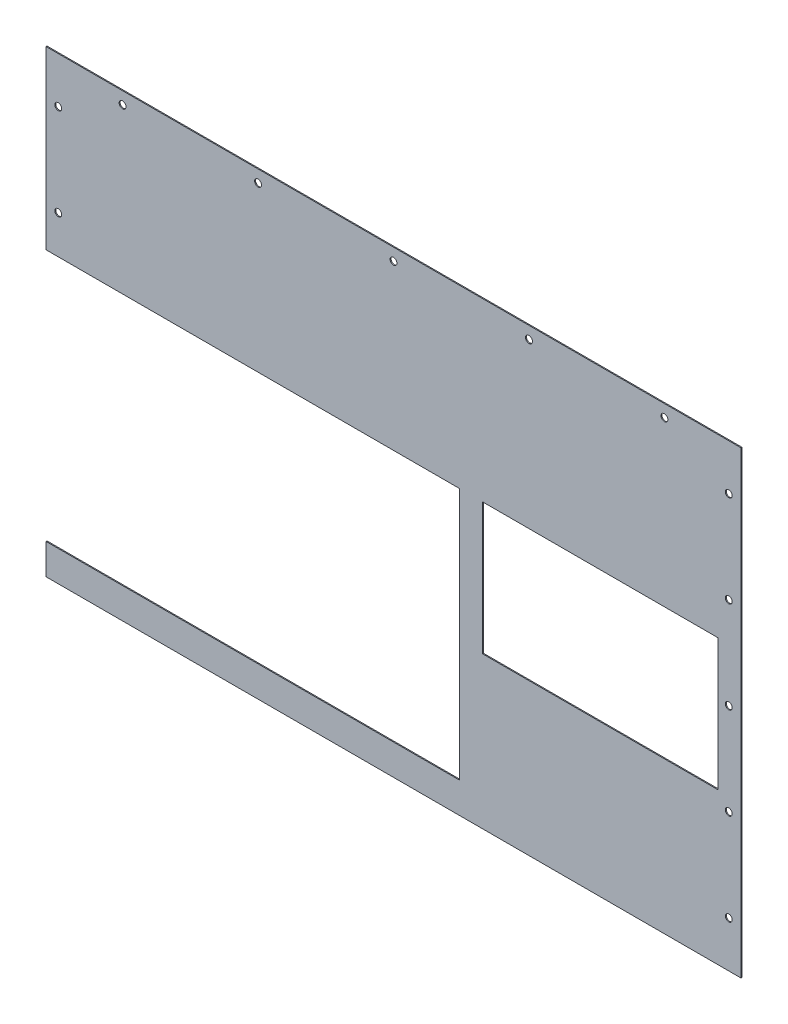
ISO-10303-21;
HEADER;
FILE_DESCRIPTION(('STEP AP214'),'2;1');
FILE_NAME('part.step','',(''),(''),'','','');
FILE_SCHEMA(('AUTOMOTIVE_DESIGN { 1 0 10303 214 1 1 1 1 }'));
ENDSEC;
DATA;
#1=APPLICATION_CONTEXT('core data for automotive mechanical design processes');
#2=APPLICATION_PROTOCOL_DEFINITION('international standard','automotive_design',2000,#1);
#3=PRODUCT_CONTEXT('',#1,'mechanical');
#4=PRODUCT('Part','Part','',(#3));
#5=PRODUCT_RELATED_PRODUCT_CATEGORY('part','',(#4));
#6=PRODUCT_DEFINITION_FORMATION('','',#4);
#7=PRODUCT_DEFINITION_CONTEXT('part definition',#1,'design');
#8=PRODUCT_DEFINITION('design','',#6,#7);
#9=PRODUCT_DEFINITION_SHAPE('','',#8);
#10=(LENGTH_UNIT() NAMED_UNIT(*) SI_UNIT(.MILLI.,.METRE.));
#11=(NAMED_UNIT(*) PLANE_ANGLE_UNIT() SI_UNIT($,.RADIAN.));
#12=(NAMED_UNIT(*) SI_UNIT($,.STERADIAN.) SOLID_ANGLE_UNIT());
#13=UNCERTAINTY_MEASURE_WITH_UNIT(LENGTH_MEASURE(1.E-05),#10,'distance_accuracy_value','');
#14=(GEOMETRIC_REPRESENTATION_CONTEXT(3) GLOBAL_UNCERTAINTY_ASSIGNED_CONTEXT((#13)) GLOBAL_UNIT_ASSIGNED_CONTEXT((#10,
#11,#12)) REPRESENTATION_CONTEXT('',''));
#15=CARTESIAN_POINT('',(0.,0.,0.));
#16=DIRECTION('',(0.,0.,1.));
#17=DIRECTION('',(1.,0.,0.));
#18=AXIS2_PLACEMENT_3D('',#15,#16,#17);
#19=CARTESIAN_POINT('',(0.,0.,0.635));
#20=DIRECTION('',(0.,0.,1.));
#21=DIRECTION('',(1.,0.,0.));
#22=AXIS2_PLACEMENT_3D('',#19,#20,#21);
#23=PLANE('',#22);
#24=CARTESIAN_POINT('',(162.424379893647,-80.1133012939924,0.635));
#25=DIRECTION('',(0.,0.,-1.));
#26=DIRECTION('',(-1.,0.,0.));
#27=AXIS2_PLACEMENT_3D('',#24,#25,#26);
#28=CIRCLE('',#27,2.248);
#29=CARTESIAN_POINT('',(160.176379893647,-80.1133012939924,0.635));
#30=VERTEX_POINT('',#29);
#31=EDGE_CURVE('E516',#30,#30,#28,.T.);
#32=ORIENTED_EDGE('',*,*,#31,.T.);
#33=EDGE_LOOP('',(#32));
#34=FACE_BOUND('',#33,.T.);
#35=CARTESIAN_POINT('',(162.424379893647,-20.1133012939924,0.635));
#36=DIRECTION('',(0.,0.,-1.));
#37=DIRECTION('',(-1.,0.,0.));
#38=AXIS2_PLACEMENT_3D('',#35,#36,#37);
#39=CIRCLE('',#38,2.248);
#40=CARTESIAN_POINT('',(160.176379893647,-20.1133012939924,0.635));
#41=VERTEX_POINT('',#40);
#42=EDGE_CURVE('E524',#41,#41,#39,.T.);
#43=ORIENTED_EDGE('',*,*,#42,.T.);
#44=EDGE_LOOP('',(#43));
#45=FACE_BOUND('',#44,.T.);
#46=CARTESIAN_POINT('',(162.424379893647,39.8866987060076,0.635));
#47=DIRECTION('',(0.,0.,-1.));
#48=DIRECTION('',(-1.,0.,0.));
#49=AXIS2_PLACEMENT_3D('',#46,#47,#48);
#50=CIRCLE('',#49,2.248);
#51=CARTESIAN_POINT('',(160.176379893647,39.8866987060076,0.635));
#52=VERTEX_POINT('',#51);
#53=EDGE_CURVE('E530',#52,#52,#50,.T.);
#54=ORIENTED_EDGE('',*,*,#53,.T.);
#55=EDGE_LOOP('',(#54));
#56=FACE_BOUND('',#55,.T.);
#57=CARTESIAN_POINT('',(162.424379893647,99.8866987060076,0.635));
#58=DIRECTION('',(0.,0.,-1.));
#59=DIRECTION('',(-1.,0.,0.));
#60=AXIS2_PLACEMENT_3D('',#57,#58,#59);
#61=CIRCLE('',#60,2.248);
#62=CARTESIAN_POINT('',(160.176379893647,99.8866987060076,0.635));
#63=VERTEX_POINT('',#62);
#64=EDGE_CURVE('E536',#63,#63,#61,.T.);
#65=ORIENTED_EDGE('',*,*,#64,.T.);
#66=EDGE_LOOP('',(#65));
#67=FACE_BOUND('',#66,.T.);
#68=CARTESIAN_POINT('',(162.424379893647,159.886698706008,0.635));
#69=DIRECTION('',(0.,0.,-1.));
#70=DIRECTION('',(-1.,0.,0.));
#71=AXIS2_PLACEMENT_3D('',#68,#69,#70);
#72=CIRCLE('',#71,2.248);
#73=CARTESIAN_POINT('',(160.176379893647,159.886698706008,0.635));
#74=VERTEX_POINT('',#73);
#75=EDGE_CURVE('E242',#74,#74,#72,.T.);
#76=ORIENTED_EDGE('',*,*,#75,.T.);
#77=EDGE_LOOP('',(#76));
#78=FACE_BOUND('',#77,.T.);
#79=CARTESIAN_POINT('',(-275.625620106353,159.886698706008,0.635));
#80=DIRECTION('',(0.,0.,1.));
#81=DIRECTION('',(1.,0.,0.));
#82=AXIS2_PLACEMENT_3D('',#79,#80,#81);
#83=CIRCLE('',#82,2.248);
#84=CARTESIAN_POINT('',(-273.377620106353,159.886698706008,0.635));
#85=VERTEX_POINT('',#84);
#86=EDGE_CURVE('E239',#85,#85,#83,.T.);
#87=ORIENTED_EDGE('',*,*,#86,.F.);
#88=EDGE_LOOP('',(#87));
#89=FACE_BOUND('',#88,.T.);
#90=CARTESIAN_POINT('',(-233.600620106353,181.911698706008,0.635));
#91=DIRECTION('',(0.,0.,1.));
#92=DIRECTION('',(1.,0.,0.));
#93=AXIS2_PLACEMENT_3D('',#90,#91,#92);
#94=CIRCLE('',#93,2.248);
#95=CARTESIAN_POINT('',(-231.352620106353,181.911698706008,0.635));
#96=VERTEX_POINT('',#95);
#97=EDGE_CURVE('E163',#96,#96,#94,.T.);
#98=ORIENTED_EDGE('',*,*,#97,.F.);
#99=EDGE_LOOP('',(#98));
#100=FACE_BOUND('',#99,.T.);
#101=DIRECTION('',(1.,0.,0.));
#102=VECTOR('',#101,1.);
#103=CARTESIAN_POINT('',(0.,74.8866987060075,0.635));
#104=LINE('',#103,#102);
#105=CARTESIAN_POINT('',(-283.600620106353,74.8866987060076,0.635));
#106=VERTEX_POINT('',#105);
#107=CARTESIAN_POINT('',(-13.600620106353,74.8866987060075,0.635));
#108=VERTEX_POINT('',#107);
#109=EDGE_CURVE('E187',#106,#108,#104,.T.);
#110=ORIENTED_EDGE('',*,*,#109,.T.);
#111=DIRECTION('',(0.,-1.,0.));
#112=VECTOR('',#111,1.);
#113=CARTESIAN_POINT('',(-13.600620106353,0.,0.635));
#114=LINE('',#113,#112);
#115=CARTESIAN_POINT('',(-13.600620106353,-90.1133012939924,0.635));
#116=VERTEX_POINT('',#115);
#117=EDGE_CURVE('E105',#108,#116,#114,.T.);
#118=ORIENTED_EDGE('',*,*,#117,.T.);
#119=DIRECTION('',(-1.,0.,0.));
#120=VECTOR('',#119,1.);
#121=CARTESIAN_POINT('',(0.,-90.1133012939924,0.635));
#122=LINE('',#121,#120);
#123=CARTESIAN_POINT('',(-283.600620106353,-90.1133012939924,0.635));
#124=VERTEX_POINT('',#123);
#125=EDGE_CURVE('E263',#116,#124,#122,.T.);
#126=ORIENTED_EDGE('',*,*,#125,.T.);
#127=DIRECTION('',(0.,-1.,0.));
#128=VECTOR('',#127,1.);
#129=CARTESIAN_POINT('',(-283.600620106353,0.,0.635));
#130=LINE('',#129,#128);
#131=CARTESIAN_POINT('',(-283.600620106353,-110.113301293992,0.635));
#132=VERTEX_POINT('',#131);
#133=EDGE_CURVE('E265',#124,#132,#130,.T.);
#134=ORIENTED_EDGE('',*,*,#133,.T.);
#135=DIRECTION('',(1.,0.,0.));
#136=VECTOR('',#135,1.);
#137=CARTESIAN_POINT('',(0.,-110.113301293992,0.635));
#138=LINE('',#137,#136);
#139=CARTESIAN_POINT('',(170.399379893647,-110.113301293992,0.635));
#140=VERTEX_POINT('',#139);
#141=EDGE_CURVE('E267',#132,#140,#138,.T.);
#142=ORIENTED_EDGE('',*,*,#141,.T.);
#143=DIRECTION('',(0.,-1.,0.));
#144=VECTOR('',#143,1.);
#145=CARTESIAN_POINT('',(170.399379893647,0.,0.635));
#146=LINE('',#145,#144);
#147=CARTESIAN_POINT('',(170.399379893647,189.886698706008,0.635));
#148=VERTEX_POINT('',#147);
#149=EDGE_CURVE('E270',#148,#140,#146,.T.);
#150=ORIENTED_EDGE('',*,*,#149,.F.);
#151=DIRECTION('',(1.,0.,0.));
#152=VECTOR('',#151,1.);
#153=CARTESIAN_POINT('',(0.,189.886698706008,0.635));
#154=LINE('',#153,#152);
#155=CARTESIAN_POINT('',(-283.600620106353,189.886698706008,0.635));
#156=VERTEX_POINT('',#155);
#157=EDGE_CURVE('E273',#156,#148,#154,.T.);
#158=ORIENTED_EDGE('',*,*,#157,.F.);
#159=EDGE_CURVE('E268',#156,#106,#130,.T.);
#160=ORIENTED_EDGE('',*,*,#159,.T.);
#161=EDGE_LOOP('',(#110,#118,#126,#134,#142,#150,#158,#160));
#162=FACE_BOUND('',#161,.T.);
#163=DIRECTION('',(1.,0.,0.));
#164=VECTOR('',#163,1.);
#165=CARTESIAN_POINT('',(0.,74.8866987060075,0.635));
#166=LINE('',#165,#164);
#167=CARTESIAN_POINT('',(1.39937989364695,74.8866987060075,0.635));
#168=VERTEX_POINT('',#167);
#169=CARTESIAN_POINT('',(155.399379893647,74.8866987060075,0.635));
#170=VERTEX_POINT('',#169);
#171=EDGE_CURVE('E139',#168,#170,#166,.T.);
#172=ORIENTED_EDGE('',*,*,#171,.T.);
#173=DIRECTION('',(0.,-1.,0.));
#174=VECTOR('',#173,1.);
#175=CARTESIAN_POINT('',(155.399379893647,0.,0.635));
#176=LINE('',#175,#174);
#177=CARTESIAN_POINT('',(155.399379893647,-11.1133012939925,0.635));
#178=VERTEX_POINT('',#177);
#179=EDGE_CURVE('E133',#170,#178,#176,.T.);
#180=ORIENTED_EDGE('',*,*,#179,.T.);
#181=DIRECTION('',(1.,0.,0.));
#182=VECTOR('',#181,1.);
#183=CARTESIAN_POINT('',(0.,-11.1133012939925,0.635));
#184=LINE('',#183,#182);
#185=CARTESIAN_POINT('',(1.39937989364696,-11.1133012939925,0.635));
#186=VERTEX_POINT('',#185);
#187=EDGE_CURVE('E138',#186,#178,#184,.T.);
#188=ORIENTED_EDGE('',*,*,#187,.F.);
#189=DIRECTION('',(0.,-1.,0.));
#190=VECTOR('',#189,1.);
#191=CARTESIAN_POINT('',(1.39937989364696,0.,0.635));
#192=LINE('',#191,#190);
#193=EDGE_CURVE('E153',#168,#186,#192,.T.);
#194=ORIENTED_EDGE('',*,*,#193,.F.);
#195=EDGE_LOOP('',(#172,#180,#188,#194));
#196=FACE_BOUND('',#195,.T.);
#197=CARTESIAN_POINT('',(-145.100620106353,181.911698706008,0.635));
#198=DIRECTION('',(0.,0.,1.));
#199=DIRECTION('',(1.,0.,0.));
#200=AXIS2_PLACEMENT_3D('',#197,#198,#199);
#201=CIRCLE('',#200,2.248);
#202=CARTESIAN_POINT('',(-142.852620106353,181.911698706008,0.635));
#203=VERTEX_POINT('',#202);
#204=EDGE_CURVE('E249',#203,#203,#201,.T.);
#205=ORIENTED_EDGE('',*,*,#204,.F.);
#206=EDGE_LOOP('',(#205));
#207=FACE_BOUND('',#206,.T.);
#208=CARTESIAN_POINT('',(-56.6006201063531,181.911698706008,0.635));
#209=DIRECTION('',(0.,0.,1.));
#210=DIRECTION('',(1.,0.,0.));
#211=AXIS2_PLACEMENT_3D('',#208,#209,#210);
#212=CIRCLE('',#211,2.248);
#213=CARTESIAN_POINT('',(-54.3526201063531,181.911698706008,0.635));
#214=VERTEX_POINT('',#213);
#215=EDGE_CURVE('E192',#214,#214,#212,.T.);
#216=ORIENTED_EDGE('',*,*,#215,.F.);
#217=EDGE_LOOP('',(#216));
#218=FACE_BOUND('',#217,.T.);
#219=CARTESIAN_POINT('',(31.8993798936469,181.911698706008,0.635));
#220=DIRECTION('',(0.,0.,1.));
#221=DIRECTION('',(1.,0.,0.));
#222=AXIS2_PLACEMENT_3D('',#219,#220,#221);
#223=CIRCLE('',#222,2.248);
#224=CARTESIAN_POINT('',(34.1473798936469,181.911698706008,0.635));
#225=VERTEX_POINT('',#224);
#226=EDGE_CURVE('E216',#225,#225,#223,.T.);
#227=ORIENTED_EDGE('',*,*,#226,.F.);
#228=EDGE_LOOP('',(#227));
#229=FACE_BOUND('',#228,.T.);
#230=CARTESIAN_POINT('',(120.399379893647,181.911698706008,0.635));
#231=DIRECTION('',(0.,0.,1.));
#232=DIRECTION('',(1.,0.,0.));
#233=AXIS2_PLACEMENT_3D('',#230,#231,#232);
#234=CIRCLE('',#233,2.248);
#235=CARTESIAN_POINT('',(122.647379893647,181.911698706008,0.635));
#236=VERTEX_POINT('',#235);
#237=EDGE_CURVE('E46',#236,#236,#234,.T.);
#238=ORIENTED_EDGE('',*,*,#237,.F.);
#239=EDGE_LOOP('',(#238));
#240=FACE_BOUND('',#239,.T.);
#241=CARTESIAN_POINT('',(-275.625620106353,99.8866987060076,0.635));
#242=DIRECTION('',(0.,0.,1.));
#243=DIRECTION('',(1.,0.,0.));
#244=AXIS2_PLACEMENT_3D('',#241,#242,#243);
#245=CIRCLE('',#244,2.248);
#246=CARTESIAN_POINT('',(-273.377620106353,99.8866987060076,0.635));
#247=VERTEX_POINT('',#246);
#248=EDGE_CURVE('E233',#247,#247,#245,.T.);
#249=ORIENTED_EDGE('',*,*,#248,.F.);
#250=EDGE_LOOP('',(#249));
#251=FACE_BOUND('',#250,.T.);
#252=ADVANCED_FACE('F37',(#34,#45,#56,#67,#78,#89,#100,#162,#196,#207,#218,#229,#240,#251),#23,.T.);
#253=CARTESIAN_POINT('',(0.,0.,0.));
#254=DIRECTION('',(0.,0.,1.));
#255=DIRECTION('',(1.,0.,0.));
#256=AXIS2_PLACEMENT_3D('',#253,#254,#255);
#257=PLANE('',#256);
#258=CARTESIAN_POINT('',(162.424379893647,-80.1133012939924,0.));
#259=DIRECTION('',(0.,0.,-1.));
#260=DIRECTION('',(-1.,0.,0.));
#261=AXIS2_PLACEMENT_3D('',#258,#259,#260);
#262=CIRCLE('',#261,2.248);
#263=CARTESIAN_POINT('',(160.176379893647,-80.1133012939924,0.));
#264=VERTEX_POINT('',#263);
#265=EDGE_CURVE('E519',#264,#264,#262,.T.);
#266=ORIENTED_EDGE('',*,*,#265,.F.);
#267=EDGE_LOOP('',(#266));
#268=FACE_BOUND('',#267,.T.);
#269=CARTESIAN_POINT('',(162.424379893647,-20.1133012939924,0.));
#270=DIRECTION('',(0.,0.,-1.));
#271=DIRECTION('',(-1.,0.,0.));
#272=AXIS2_PLACEMENT_3D('',#269,#270,#271);
#273=CIRCLE('',#272,2.248);
#274=CARTESIAN_POINT('',(160.176379893647,-20.1133012939924,0.));
#275=VERTEX_POINT('',#274);
#276=EDGE_CURVE('E521',#275,#275,#273,.T.);
#277=ORIENTED_EDGE('',*,*,#276,.F.);
#278=EDGE_LOOP('',(#277));
#279=FACE_BOUND('',#278,.T.);
#280=CARTESIAN_POINT('',(162.424379893647,39.8866987060076,0.));
#281=DIRECTION('',(0.,0.,-1.));
#282=DIRECTION('',(-1.,0.,0.));
#283=AXIS2_PLACEMENT_3D('',#280,#281,#282);
#284=CIRCLE('',#283,2.248);
#285=CARTESIAN_POINT('',(160.176379893647,39.8866987060076,0.));
#286=VERTEX_POINT('',#285);
#287=EDGE_CURVE('E527',#286,#286,#284,.T.);
#288=ORIENTED_EDGE('',*,*,#287,.F.);
#289=EDGE_LOOP('',(#288));
#290=FACE_BOUND('',#289,.T.);
#291=CARTESIAN_POINT('',(162.424379893647,99.8866987060076,0.));
#292=DIRECTION('',(0.,0.,-1.));
#293=DIRECTION('',(-1.,0.,0.));
#294=AXIS2_PLACEMENT_3D('',#291,#292,#293);
#295=CIRCLE('',#294,2.248);
#296=CARTESIAN_POINT('',(160.176379893647,99.8866987060076,0.));
#297=VERTEX_POINT('',#296);
#298=EDGE_CURVE('E533',#297,#297,#295,.T.);
#299=ORIENTED_EDGE('',*,*,#298,.F.);
#300=EDGE_LOOP('',(#299));
#301=FACE_BOUND('',#300,.T.);
#302=CARTESIAN_POINT('',(162.424379893647,159.886698706008,0.));
#303=DIRECTION('',(0.,0.,-1.));
#304=DIRECTION('',(-1.,0.,0.));
#305=AXIS2_PLACEMENT_3D('',#302,#303,#304);
#306=CIRCLE('',#305,2.248);
#307=CARTESIAN_POINT('',(160.176379893647,159.886698706008,0.));
#308=VERTEX_POINT('',#307);
#309=EDGE_CURVE('E245',#308,#308,#306,.T.);
#310=ORIENTED_EDGE('',*,*,#309,.F.);
#311=EDGE_LOOP('',(#310));
#312=FACE_BOUND('',#311,.T.);
#313=CARTESIAN_POINT('',(-275.625620106353,159.886698706008,0.));
#314=DIRECTION('',(0.,0.,1.));
#315=DIRECTION('',(1.,0.,0.));
#316=AXIS2_PLACEMENT_3D('',#313,#314,#315);
#317=CIRCLE('',#316,2.248);
#318=CARTESIAN_POINT('',(-273.377620106353,159.886698706008,0.));
#319=VERTEX_POINT('',#318);
#320=EDGE_CURVE('E235',#319,#319,#317,.T.);
#321=ORIENTED_EDGE('',*,*,#320,.T.);
#322=EDGE_LOOP('',(#321));
#323=FACE_BOUND('',#322,.T.);
#324=CARTESIAN_POINT('',(-233.600620106353,181.911698706008,0.));
#325=DIRECTION('',(0.,0.,1.));
#326=DIRECTION('',(1.,0.,0.));
#327=AXIS2_PLACEMENT_3D('',#324,#325,#326);
#328=CIRCLE('',#327,2.248);
#329=CARTESIAN_POINT('',(-231.352620106353,181.911698706008,0.));
#330=VERTEX_POINT('',#329);
#331=EDGE_CURVE('E256',#330,#330,#328,.T.);
#332=ORIENTED_EDGE('',*,*,#331,.T.);
#333=EDGE_LOOP('',(#332));
#334=FACE_BOUND('',#333,.T.);
#335=DIRECTION('',(1.,0.,0.));
#336=VECTOR('',#335,1.);
#337=CARTESIAN_POINT('',(0.,74.8866987060075,0.));
#338=LINE('',#337,#336);
#339=CARTESIAN_POINT('',(-283.600620106353,74.8866987060076,0.));
#340=VERTEX_POINT('',#339);
#341=CARTESIAN_POINT('',(-13.600620106353,74.8866987060075,0.));
#342=VERTEX_POINT('',#341);
#343=EDGE_CURVE('E159',#340,#342,#338,.T.);
#344=ORIENTED_EDGE('',*,*,#343,.F.);
#345=DIRECTION('',(0.,-1.,0.));
#346=VECTOR('',#345,1.);
#347=CARTESIAN_POINT('',(-283.600620106353,0.,0.));
#348=LINE('',#347,#346);
#349=CARTESIAN_POINT('',(-283.600620106353,189.886698706008,0.));
#350=VERTEX_POINT('',#349);
#351=EDGE_CURVE('E170',#350,#340,#348,.T.);
#352=ORIENTED_EDGE('',*,*,#351,.F.);
#353=DIRECTION('',(1.,0.,0.));
#354=VECTOR('',#353,1.);
#355=CARTESIAN_POINT('',(0.,189.886698706008,0.));
#356=LINE('',#355,#354);
#357=CARTESIAN_POINT('',(170.399379893647,189.886698706008,0.));
#358=VERTEX_POINT('',#357);
#359=EDGE_CURVE('E176',#350,#358,#356,.T.);
#360=ORIENTED_EDGE('',*,*,#359,.T.);
#361=DIRECTION('',(0.,-1.,0.));
#362=VECTOR('',#361,1.);
#363=CARTESIAN_POINT('',(170.399379893647,0.,0.));
#364=LINE('',#363,#362);
#365=CARTESIAN_POINT('',(170.399379893647,-110.113301293992,0.));
#366=VERTEX_POINT('',#365);
#367=EDGE_CURVE('E173',#358,#366,#364,.T.);
#368=ORIENTED_EDGE('',*,*,#367,.T.);
#369=DIRECTION('',(1.,0.,0.));
#370=VECTOR('',#369,1.);
#371=CARTESIAN_POINT('',(0.,-110.113301293992,0.));
#372=LINE('',#371,#370);
#373=CARTESIAN_POINT('',(-283.600620106353,-110.113301293992,0.));
#374=VERTEX_POINT('',#373);
#375=EDGE_CURVE('E169',#374,#366,#372,.T.);
#376=ORIENTED_EDGE('',*,*,#375,.F.);
#377=CARTESIAN_POINT('',(-283.600620106353,-90.1133012939924,0.));
#378=VERTEX_POINT('',#377);
#379=EDGE_CURVE('E167',#378,#374,#348,.T.);
#380=ORIENTED_EDGE('',*,*,#379,.F.);
#381=DIRECTION('',(-1.,0.,0.));
#382=VECTOR('',#381,1.);
#383=CARTESIAN_POINT('',(0.,-90.1133012939924,0.));
#384=LINE('',#383,#382);
#385=CARTESIAN_POINT('',(-13.600620106353,-90.1133012939924,0.));
#386=VERTEX_POINT('',#385);
#387=EDGE_CURVE('E165',#386,#378,#384,.T.);
#388=ORIENTED_EDGE('',*,*,#387,.F.);
#389=DIRECTION('',(0.,-1.,0.));
#390=VECTOR('',#389,1.);
#391=CARTESIAN_POINT('',(-13.600620106353,0.,0.));
#392=LINE('',#391,#390);
#393=EDGE_CURVE('E162',#342,#386,#392,.T.);
#394=ORIENTED_EDGE('',*,*,#393,.F.);
#395=EDGE_LOOP('',(#344,#352,#360,#368,#376,#380,#388,#394));
#396=FACE_BOUND('',#395,.T.);
#397=DIRECTION('',(1.,0.,0.));
#398=VECTOR('',#397,1.);
#399=CARTESIAN_POINT('',(0.,74.8866987060075,0.));
#400=LINE('',#399,#398);
#401=CARTESIAN_POINT('',(1.39937989364695,74.8866987060075,0.));
#402=VERTEX_POINT('',#401);
#403=CARTESIAN_POINT('',(155.399379893647,74.8866987060075,0.));
#404=VERTEX_POINT('',#403);
#405=EDGE_CURVE('E179',#402,#404,#400,.T.);
#406=ORIENTED_EDGE('',*,*,#405,.F.);
#407=DIRECTION('',(0.,-1.,0.));
#408=VECTOR('',#407,1.);
#409=CARTESIAN_POINT('',(1.39937989364696,0.,0.));
#410=LINE('',#409,#408);
#411=CARTESIAN_POINT('',(1.39937989364696,-11.1133012939925,0.));
#412=VERTEX_POINT('',#411);
#413=EDGE_CURVE('E184',#402,#412,#410,.T.);
#414=ORIENTED_EDGE('',*,*,#413,.T.);
#415=DIRECTION('',(1.,0.,0.));
#416=VECTOR('',#415,1.);
#417=CARTESIAN_POINT('',(0.,-11.1133012939925,0.));
#418=LINE('',#417,#416);
#419=CARTESIAN_POINT('',(155.399379893647,-11.1133012939925,0.));
#420=VERTEX_POINT('',#419);
#421=EDGE_CURVE('E182',#412,#420,#418,.T.);
#422=ORIENTED_EDGE('',*,*,#421,.T.);
#423=DIRECTION('',(0.,-1.,0.));
#424=VECTOR('',#423,1.);
#425=CARTESIAN_POINT('',(155.399379893647,0.,0.));
#426=LINE('',#425,#424);
#427=EDGE_CURVE('E147',#404,#420,#426,.T.);
#428=ORIENTED_EDGE('',*,*,#427,.F.);
#429=EDGE_LOOP('',(#406,#414,#422,#428));
#430=FACE_BOUND('',#429,.T.);
#431=CARTESIAN_POINT('',(-145.100620106353,181.911698706008,0.));
#432=DIRECTION('',(0.,0.,1.));
#433=DIRECTION('',(1.,0.,0.));
#434=AXIS2_PLACEMENT_3D('',#431,#432,#433);
#435=CIRCLE('',#434,2.248);
#436=CARTESIAN_POINT('',(-142.852620106353,181.911698706008,0.));
#437=VERTEX_POINT('',#436);
#438=EDGE_CURVE('E253',#437,#437,#435,.T.);
#439=ORIENTED_EDGE('',*,*,#438,.T.);
#440=EDGE_LOOP('',(#439));
#441=FACE_BOUND('',#440,.T.);
#442=CARTESIAN_POINT('',(-56.6006201063531,181.911698706008,0.));
#443=DIRECTION('',(0.,0.,1.));
#444=DIRECTION('',(1.,0.,0.));
#445=AXIS2_PLACEMENT_3D('',#442,#443,#444);
#446=CIRCLE('',#445,2.248);
#447=CARTESIAN_POINT('',(-54.3526201063531,181.911698706008,0.));
#448=VERTEX_POINT('',#447);
#449=EDGE_CURVE('E213',#448,#448,#446,.T.);
#450=ORIENTED_EDGE('',*,*,#449,.T.);
#451=EDGE_LOOP('',(#450));
#452=FACE_BOUND('',#451,.T.);
#453=CARTESIAN_POINT('',(31.8993798936469,181.911698706008,0.));
#454=DIRECTION('',(0.,0.,1.));
#455=DIRECTION('',(1.,0.,0.));
#456=AXIS2_PLACEMENT_3D('',#453,#454,#455);
#457=CIRCLE('',#456,2.248);
#458=CARTESIAN_POINT('',(34.1473798936469,181.911698706008,0.));
#459=VERTEX_POINT('',#458);
#460=EDGE_CURVE('E219',#459,#459,#457,.T.);
#461=ORIENTED_EDGE('',*,*,#460,.T.);
#462=EDGE_LOOP('',(#461));
#463=FACE_BOUND('',#462,.T.);
#464=CARTESIAN_POINT('',(120.399379893647,181.911698706008,0.));
#465=DIRECTION('',(0.,0.,1.));
#466=DIRECTION('',(1.,0.,0.));
#467=AXIS2_PLACEMENT_3D('',#464,#465,#466);
#468=CIRCLE('',#467,2.248);
#469=CARTESIAN_POINT('',(122.647379893647,181.911698706008,0.));
#470=VERTEX_POINT('',#469);
#471=EDGE_CURVE('E11',#470,#470,#468,.T.);
#472=ORIENTED_EDGE('',*,*,#471,.T.);
#473=EDGE_LOOP('',(#472));
#474=FACE_BOUND('',#473,.T.);
#475=CARTESIAN_POINT('',(-275.625620106353,99.8866987060076,0.));
#476=DIRECTION('',(0.,0.,1.));
#477=DIRECTION('',(1.,0.,0.));
#478=AXIS2_PLACEMENT_3D('',#475,#476,#477);
#479=CIRCLE('',#478,2.248);
#480=CARTESIAN_POINT('',(-273.377620106353,99.8866987060076,0.));
#481=VERTEX_POINT('',#480);
#482=EDGE_CURVE('E236',#481,#481,#479,.T.);
#483=ORIENTED_EDGE('',*,*,#482,.T.);
#484=EDGE_LOOP('',(#483));
#485=FACE_BOUND('',#484,.T.);
#486=ADVANCED_FACE('F228',(#268,#279,#290,#301,#312,#323,#334,#396,#430,#441,#452,#463,#474,
#485),#257,.F.);
#487=CARTESIAN_POINT('',(0.,74.8866987060075,0.635));
#488=DIRECTION('',(0.,1.,0.));
#489=DIRECTION('',(0.,0.,1.));
#490=AXIS2_PLACEMENT_3D('',#487,#488,#489);
#491=PLANE('',#490);
#492=ORIENTED_EDGE('',*,*,#405,.T.);
#493=DIRECTION('',(0.,0.,-1.));
#494=VECTOR('',#493,1.);
#495=CARTESIAN_POINT('',(155.399379893647,74.8866987060075,0.635));
#496=LINE('',#495,#494);
#497=EDGE_CURVE('E150',#170,#404,#496,.T.);
#498=ORIENTED_EDGE('',*,*,#497,.F.);
#499=ORIENTED_EDGE('',*,*,#171,.F.);
#500=DIRECTION('',(0.,0.,-1.));
#501=VECTOR('',#500,1.);
#502=CARTESIAN_POINT('',(1.39937989364695,74.8866987060075,0.635));
#503=LINE('',#502,#501);
#504=EDGE_CURVE('E54',#168,#402,#503,.T.);
#505=ORIENTED_EDGE('',*,*,#504,.T.);
#506=EDGE_LOOP('',(#492,#498,#499,#505));
#507=FACE_BOUND('',#506,.T.);
#508=ADVANCED_FACE('F345',(#507),#491,.F.);
#509=CARTESIAN_POINT('',(155.399379893647,0.,0.635));
#510=DIRECTION('',(1.,0.,0.));
#511=DIRECTION('',(0.,1.,0.));
#512=AXIS2_PLACEMENT_3D('',#509,#510,#511);
#513=PLANE('',#512);
#514=ORIENTED_EDGE('',*,*,#427,.T.);
#515=DIRECTION('',(0.,0.,-1.));
#516=VECTOR('',#515,1.);
#517=CARTESIAN_POINT('',(155.399379893647,-11.1133012939925,0.635));
#518=LINE('',#517,#516);
#519=EDGE_CURVE('E145',#178,#420,#518,.T.);
#520=ORIENTED_EDGE('',*,*,#519,.F.);
#521=ORIENTED_EDGE('',*,*,#179,.F.);
#522=ORIENTED_EDGE('',*,*,#497,.T.);
#523=EDGE_LOOP('',(#514,#520,#521,#522));
#524=FACE_BOUND('',#523,.T.);
#525=ADVANCED_FACE('F146',(#524),#513,.F.);
#526=CARTESIAN_POINT('',(0.,-11.1133012939925,0.635));
#527=DIRECTION('',(0.,1.,0.));
#528=DIRECTION('',(0.,0.,1.));
#529=AXIS2_PLACEMENT_3D('',#526,#527,#528);
#530=PLANE('',#529);
#531=ORIENTED_EDGE('',*,*,#421,.F.);
#532=DIRECTION('',(0.,0.,-1.));
#533=VECTOR('',#532,1.);
#534=CARTESIAN_POINT('',(1.39937989364696,-11.1133012939925,0.635));
#535=LINE('',#534,#533);
#536=EDGE_CURVE('E92',#186,#412,#535,.T.);
#537=ORIENTED_EDGE('',*,*,#536,.F.);
#538=ORIENTED_EDGE('',*,*,#187,.T.);
#539=ORIENTED_EDGE('',*,*,#519,.T.);
#540=EDGE_LOOP('',(#531,#537,#538,#539));
#541=FACE_BOUND('',#540,.T.);
#542=ADVANCED_FACE('F152',(#541),#530,.T.);
#543=CARTESIAN_POINT('',(0.,74.8866987060075,0.635));
#544=DIRECTION('',(0.,1.,0.));
#545=DIRECTION('',(-1.,0.,0.));
#546=AXIS2_PLACEMENT_3D('',#543,#544,#545);
#547=PLANE('',#546);
#548=ORIENTED_EDGE('',*,*,#343,.T.);
#549=DIRECTION('',(0.,0.,-1.));
#550=VECTOR('',#549,1.);
#551=CARTESIAN_POINT('',(-13.600620106353,74.8866987060075,0.635));
#552=LINE('',#551,#550);
#553=EDGE_CURVE('E189',#108,#342,#552,.T.);
#554=ORIENTED_EDGE('',*,*,#553,.F.);
#555=ORIENTED_EDGE('',*,*,#109,.F.);
#556=DIRECTION('',(0.,0.,-1.));
#557=VECTOR('',#556,1.);
#558=CARTESIAN_POINT('',(-283.600620106353,74.8866987060076,0.635));
#559=LINE('',#558,#557);
#560=EDGE_CURVE('E155',#106,#340,#559,.T.);
#561=ORIENTED_EDGE('',*,*,#560,.T.);
#562=EDGE_LOOP('',(#548,#554,#555,#561));
#563=FACE_BOUND('',#562,.T.);
#564=ADVANCED_FACE('F287',(#563),#547,.F.);
#565=CARTESIAN_POINT('',(-13.600620106353,0.,0.635));
#566=DIRECTION('',(1.,0.,0.));
#567=DIRECTION('',(0.,1.,0.));
#568=AXIS2_PLACEMENT_3D('',#565,#566,#567);
#569=PLANE('',#568);
#570=ORIENTED_EDGE('',*,*,#393,.T.);
#571=DIRECTION('',(0.,0.,-1.));
#572=VECTOR('',#571,1.);
#573=CARTESIAN_POINT('',(-13.600620106353,-90.1133012939924,0.635));
#574=LINE('',#573,#572);
#575=EDGE_CURVE('E207',#116,#386,#574,.T.);
#576=ORIENTED_EDGE('',*,*,#575,.F.);
#577=ORIENTED_EDGE('',*,*,#117,.F.);
#578=ORIENTED_EDGE('',*,*,#553,.T.);
#579=EDGE_LOOP('',(#570,#576,#577,#578));
#580=FACE_BOUND('',#579,.T.);
#581=ADVANCED_FACE('F288',(#580),#569,.F.);
#582=CARTESIAN_POINT('',(0.,-90.1133012939924,0.635));
#583=DIRECTION('',(0.,-1.,0.));
#584=DIRECTION('',(1.,0.,0.));
#585=AXIS2_PLACEMENT_3D('',#582,#583,#584);
#586=PLANE('',#585);
#587=ORIENTED_EDGE('',*,*,#387,.T.);
#588=DIRECTION('',(0.,0.,-1.));
#589=VECTOR('',#588,1.);
#590=CARTESIAN_POINT('',(-283.600620106353,-90.1133012939924,0.635));
#591=LINE('',#590,#589);
#592=EDGE_CURVE('E204',#124,#378,#591,.T.);
#593=ORIENTED_EDGE('',*,*,#592,.F.);
#594=ORIENTED_EDGE('',*,*,#125,.F.);
#595=ORIENTED_EDGE('',*,*,#575,.T.);
#596=EDGE_LOOP('',(#587,#593,#594,#595));
#597=FACE_BOUND('',#596,.T.);
#598=ADVANCED_FACE('F293',(#597),#586,.F.);
#599=CARTESIAN_POINT('',(-283.600620106353,0.,0.635));
#600=DIRECTION('',(1.,0.,0.));
#601=DIRECTION('',(0.,0.,-1.));
#602=AXIS2_PLACEMENT_3D('',#599,#600,#601);
#603=PLANE('',#602);
#604=ORIENTED_EDGE('',*,*,#379,.T.);
#605=DIRECTION('',(0.,0.,-1.));
#606=VECTOR('',#605,1.);
#607=CARTESIAN_POINT('',(-283.600620106353,-110.113301293992,0.635));
#608=LINE('',#607,#606);
#609=EDGE_CURVE('E201',#132,#374,#608,.T.);
#610=ORIENTED_EDGE('',*,*,#609,.F.);
#611=ORIENTED_EDGE('',*,*,#133,.F.);
#612=ORIENTED_EDGE('',*,*,#592,.T.);
#613=EDGE_LOOP('',(#604,#610,#611,#612));
#614=FACE_BOUND('',#613,.T.);
#615=ADVANCED_FACE('F300',(#614),#603,.F.);
#616=CARTESIAN_POINT('',(0.,-110.113301293992,0.635));
#617=DIRECTION('',(0.,1.,0.));
#618=DIRECTION('',(0.,0.,1.));
#619=AXIS2_PLACEMENT_3D('',#616,#617,#618);
#620=PLANE('',#619);
#621=ORIENTED_EDGE('',*,*,#375,.T.);
#622=DIRECTION('',(0.,0.,-1.));
#623=VECTOR('',#622,1.);
#624=CARTESIAN_POINT('',(170.399379893647,-110.113301293992,0.635));
#625=LINE('',#624,#623);
#626=EDGE_CURVE('E199',#140,#366,#625,.T.);
#627=ORIENTED_EDGE('',*,*,#626,.F.);
#628=ORIENTED_EDGE('',*,*,#141,.F.);
#629=ORIENTED_EDGE('',*,*,#609,.T.);
#630=EDGE_LOOP('',(#621,#627,#628,#629));
#631=FACE_BOUND('',#630,.T.);
#632=ADVANCED_FACE('F304',(#631),#620,.F.);
#633=CARTESIAN_POINT('',(170.399379893647,0.,0.635));
#634=DIRECTION('',(1.,0.,0.));
#635=DIRECTION('',(0.,1.,0.));
#636=AXIS2_PLACEMENT_3D('',#633,#634,#635);
#637=PLANE('',#636);
#638=ORIENTED_EDGE('',*,*,#367,.F.);
#639=DIRECTION('',(0.,0.,-1.));
#640=VECTOR('',#639,1.);
#641=CARTESIAN_POINT('',(170.399379893647,189.886698706008,0.635));
#642=LINE('',#641,#640);
#643=EDGE_CURVE('E197',#148,#358,#642,.T.);
#644=ORIENTED_EDGE('',*,*,#643,.F.);
#645=ORIENTED_EDGE('',*,*,#149,.T.);
#646=ORIENTED_EDGE('',*,*,#626,.T.);
#647=EDGE_LOOP('',(#638,#644,#645,#646));
#648=FACE_BOUND('',#647,.T.);
#649=ADVANCED_FACE('F311',(#648),#637,.T.);
#650=CARTESIAN_POINT('',(0.,189.886698706008,0.635));
#651=DIRECTION('',(0.,1.,0.));
#652=DIRECTION('',(0.,0.,1.));
#653=AXIS2_PLACEMENT_3D('',#650,#651,#652);
#654=PLANE('',#653);
#655=ORIENTED_EDGE('',*,*,#359,.F.);
#656=DIRECTION('',(0.,0.,-1.));
#657=VECTOR('',#656,1.);
#658=CARTESIAN_POINT('',(-283.600620106353,189.886698706008,0.635));
#659=LINE('',#658,#657);
#660=EDGE_CURVE('E195',#156,#350,#659,.T.);
#661=ORIENTED_EDGE('',*,*,#660,.F.);
#662=ORIENTED_EDGE('',*,*,#157,.T.);
#663=ORIENTED_EDGE('',*,*,#643,.T.);
#664=EDGE_LOOP('',(#655,#661,#662,#663));
#665=FACE_BOUND('',#664,.T.);
#666=ADVANCED_FACE('F309',(#665),#654,.T.);
#667=ORIENTED_EDGE('',*,*,#351,.T.);
#668=ORIENTED_EDGE('',*,*,#560,.F.);
#669=ORIENTED_EDGE('',*,*,#159,.F.);
#670=ORIENTED_EDGE('',*,*,#660,.T.);
#671=EDGE_LOOP('',(#667,#668,#669,#670));
#672=FACE_BOUND('',#671,.T.);
#673=ADVANCED_FACE('F283',(#672),#603,.F.);
#674=CARTESIAN_POINT('',(1.39937989364696,0.,0.635));
#675=DIRECTION('',(1.,0.,0.));
#676=DIRECTION('',(0.,1.,0.));
#677=AXIS2_PLACEMENT_3D('',#674,#675,#676);
#678=PLANE('',#677);
#679=ORIENTED_EDGE('',*,*,#413,.F.);
#680=ORIENTED_EDGE('',*,*,#504,.F.);
#681=ORIENTED_EDGE('',*,*,#193,.T.);
#682=ORIENTED_EDGE('',*,*,#536,.T.);
#683=EDGE_LOOP('',(#679,#680,#681,#682));
#684=FACE_BOUND('',#683,.T.);
#685=ADVANCED_FACE('F372',(#684),#678,.T.);
#686=CARTESIAN_POINT('',(-233.600620106353,181.911698706008,0.635));
#687=DIRECTION('',(0.,0.,-1.));
#688=DIRECTION('',(-1.,0.,0.));
#689=AXIS2_PLACEMENT_3D('',#686,#687,#688);
#690=CYLINDRICAL_SURFACE('',#689,2.248);
#691=ORIENTED_EDGE('',*,*,#97,.T.);
#692=EDGE_LOOP('',(#691));
#693=FACE_BOUND('',#692,.T.);
#694=ORIENTED_EDGE('',*,*,#331,.F.);
#695=EDGE_LOOP('',(#694));
#696=FACE_BOUND('',#695,.T.);
#697=ADVANCED_FACE('F369',(#693,#696),#690,.F.);
#698=CARTESIAN_POINT('',(-145.100620106353,181.911698706008,0.635));
#699=DIRECTION('',(0.,0.,-1.));
#700=DIRECTION('',(-1.,0.,0.));
#701=AXIS2_PLACEMENT_3D('',#698,#699,#700);
#702=CYLINDRICAL_SURFACE('',#701,2.248);
#703=ORIENTED_EDGE('',*,*,#204,.T.);
#704=EDGE_LOOP('',(#703));
#705=FACE_BOUND('',#704,.T.);
#706=ORIENTED_EDGE('',*,*,#438,.F.);
#707=EDGE_LOOP('',(#706));
#708=FACE_BOUND('',#707,.T.);
#709=ADVANCED_FACE('F331',(#705,#708),#702,.F.);
#710=CARTESIAN_POINT('',(-56.6006201063531,181.911698706008,0.635));
#711=DIRECTION('',(0.,0.,-1.));
#712=DIRECTION('',(-1.,0.,0.));
#713=AXIS2_PLACEMENT_3D('',#710,#711,#712);
#714=CYLINDRICAL_SURFACE('',#713,2.248);
#715=ORIENTED_EDGE('',*,*,#215,.T.);
#716=EDGE_LOOP('',(#715));
#717=FACE_BOUND('',#716,.T.);
#718=ORIENTED_EDGE('',*,*,#449,.F.);
#719=EDGE_LOOP('',(#718));
#720=FACE_BOUND('',#719,.T.);
#721=ADVANCED_FACE('F328',(#717,#720),#714,.F.);
#722=CARTESIAN_POINT('',(31.8993798936469,181.911698706008,0.635));
#723=DIRECTION('',(0.,0.,-1.));
#724=DIRECTION('',(-1.,0.,0.));
#725=AXIS2_PLACEMENT_3D('',#722,#723,#724);
#726=CYLINDRICAL_SURFACE('',#725,2.248);
#727=ORIENTED_EDGE('',*,*,#226,.T.);
#728=EDGE_LOOP('',(#727));
#729=FACE_BOUND('',#728,.T.);
#730=ORIENTED_EDGE('',*,*,#460,.F.);
#731=EDGE_LOOP('',(#730));
#732=FACE_BOUND('',#731,.T.);
#733=ADVANCED_FACE('F330',(#729,#732),#726,.F.);
#734=CARTESIAN_POINT('',(120.399379893647,181.911698706008,0.635));
#735=DIRECTION('',(0.,0.,-1.));
#736=DIRECTION('',(-1.,0.,0.));
#737=AXIS2_PLACEMENT_3D('',#734,#735,#736);
#738=CYLINDRICAL_SURFACE('',#737,2.248);
#739=ORIENTED_EDGE('',*,*,#237,.T.);
#740=EDGE_LOOP('',(#739));
#741=FACE_BOUND('',#740,.T.);
#742=ORIENTED_EDGE('',*,*,#471,.F.);
#743=EDGE_LOOP('',(#742));
#744=FACE_BOUND('',#743,.T.);
#745=ADVANCED_FACE('F39',(#741,#744),#738,.F.);
#746=CARTESIAN_POINT('',(-275.625620106353,159.886698706008,0.635));
#747=DIRECTION('',(0.,0.,-1.));
#748=DIRECTION('',(-1.,0.,0.));
#749=AXIS2_PLACEMENT_3D('',#746,#747,#748);
#750=CYLINDRICAL_SURFACE('',#749,2.248);
#751=ORIENTED_EDGE('',*,*,#86,.T.);
#752=EDGE_LOOP('',(#751));
#753=FACE_BOUND('',#752,.T.);
#754=ORIENTED_EDGE('',*,*,#320,.F.);
#755=EDGE_LOOP('',(#754));
#756=FACE_BOUND('',#755,.T.);
#757=ADVANCED_FACE('F338',(#753,#756),#750,.F.);
#758=CARTESIAN_POINT('',(-275.625620106353,99.8866987060076,0.635));
#759=DIRECTION('',(0.,0.,-1.));
#760=DIRECTION('',(-1.,0.,0.));
#761=AXIS2_PLACEMENT_3D('',#758,#759,#760);
#762=CYLINDRICAL_SURFACE('',#761,2.248);
#763=ORIENTED_EDGE('',*,*,#248,.T.);
#764=EDGE_LOOP('',(#763));
#765=FACE_BOUND('',#764,.T.);
#766=ORIENTED_EDGE('',*,*,#482,.F.);
#767=EDGE_LOOP('',(#766));
#768=FACE_BOUND('',#767,.T.);
#769=ADVANCED_FACE('F352',(#765,#768),#762,.F.);
#770=CARTESIAN_POINT('',(162.424379893647,159.886698706008,0.635));
#771=DIRECTION('',(0.,0.,-1.));
#772=DIRECTION('',(-1.,0.,0.));
#773=AXIS2_PLACEMENT_3D('',#770,#771,#772);
#774=CYLINDRICAL_SURFACE('',#773,2.248);
#775=ORIENTED_EDGE('',*,*,#75,.F.);
#776=EDGE_LOOP('',(#775));
#777=FACE_BOUND('',#776,.T.);
#778=ORIENTED_EDGE('',*,*,#309,.T.);
#779=EDGE_LOOP('',(#778));
#780=FACE_BOUND('',#779,.T.);
#781=ADVANCED_FACE('F354',(#777,#780),#774,.F.);
#782=CARTESIAN_POINT('',(162.424379893647,99.8866987060076,0.635));
#783=DIRECTION('',(0.,0.,-1.));
#784=DIRECTION('',(-1.,0.,0.));
#785=AXIS2_PLACEMENT_3D('',#782,#783,#784);
#786=CYLINDRICAL_SURFACE('',#785,2.248);
#787=ORIENTED_EDGE('',*,*,#64,.F.);
#788=EDGE_LOOP('',(#787));
#789=FACE_BOUND('',#788,.T.);
#790=ORIENTED_EDGE('',*,*,#298,.T.);
#791=EDGE_LOOP('',(#790));
#792=FACE_BOUND('',#791,.T.);
#793=ADVANCED_FACE('F360',(#789,#792),#786,.F.);
#794=CARTESIAN_POINT('',(162.424379893647,39.8866987060076,0.635));
#795=DIRECTION('',(0.,0.,-1.));
#796=DIRECTION('',(-1.,0.,0.));
#797=AXIS2_PLACEMENT_3D('',#794,#795,#796);
#798=CYLINDRICAL_SURFACE('',#797,2.248);
#799=ORIENTED_EDGE('',*,*,#53,.F.);
#800=EDGE_LOOP('',(#799));
#801=FACE_BOUND('',#800,.T.);
#802=ORIENTED_EDGE('',*,*,#287,.T.);
#803=EDGE_LOOP('',(#802));
#804=FACE_BOUND('',#803,.T.);
#805=ADVANCED_FACE('F480',(#801,#804),#798,.F.);
#806=CARTESIAN_POINT('',(162.424379893647,-20.1133012939924,0.635));
#807=DIRECTION('',(0.,0.,-1.));
#808=DIRECTION('',(-1.,0.,0.));
#809=AXIS2_PLACEMENT_3D('',#806,#807,#808);
#810=CYLINDRICAL_SURFACE('',#809,2.248);
#811=ORIENTED_EDGE('',*,*,#42,.F.);
#812=EDGE_LOOP('',(#811));
#813=FACE_BOUND('',#812,.T.);
#814=ORIENTED_EDGE('',*,*,#276,.T.);
#815=EDGE_LOOP('',(#814));
#816=FACE_BOUND('',#815,.T.);
#817=ADVANCED_FACE('F489',(#813,#816),#810,.F.);
#818=CARTESIAN_POINT('',(162.424379893647,-80.1133012939924,0.635));
#819=DIRECTION('',(0.,0.,-1.));
#820=DIRECTION('',(-1.,0.,0.));
#821=AXIS2_PLACEMENT_3D('',#818,#819,#820);
#822=CYLINDRICAL_SURFACE('',#821,2.248);
#823=ORIENTED_EDGE('',*,*,#31,.F.);
#824=EDGE_LOOP('',(#823));
#825=FACE_BOUND('',#824,.T.);
#826=ORIENTED_EDGE('',*,*,#265,.T.);
#827=EDGE_LOOP('',(#826));
#828=FACE_BOUND('',#827,.T.);
#829=ADVANCED_FACE('F499',(#825,#828),#822,.F.);
#830=CLOSED_SHELL('',(#252,#486,#508,#525,#542,#564,#581,#598,#615,#632,#649,#666,#673,#685,
#697,#709,#721,#733,#745,#757,#769,#781,#793,#805,#817,#829));
#831=MANIFOLD_SOLID_BREP('B2',#830);
#832=ADVANCED_BREP_SHAPE_REPRESENTATION('',(#18,#831),#14);
#833=SHAPE_DEFINITION_REPRESENTATION(#9,#832);
ENDSEC;
END-ISO-10303-21;
